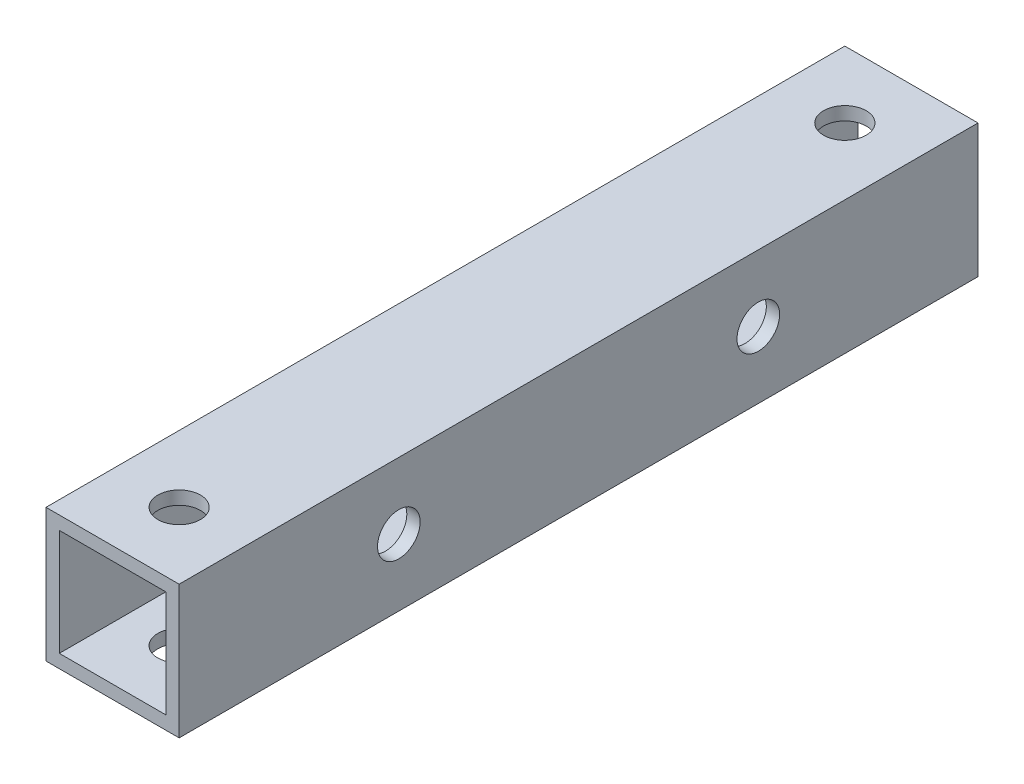
ISO-10303-21;
HEADER;
FILE_DESCRIPTION(('STEP AP214'),'2;1');
FILE_NAME('part.step','',(''),(''),'','','');
FILE_SCHEMA(('AUTOMOTIVE_DESIGN { 1 0 10303 214 1 1 1 1 }'));
ENDSEC;
DATA;
#1=APPLICATION_CONTEXT('core data for automotive mechanical design processes');
#2=APPLICATION_PROTOCOL_DEFINITION('international standard','automotive_design',2000,#1);
#3=PRODUCT_CONTEXT('',#1,'mechanical');
#4=PRODUCT('Part','Part','',(#3));
#5=PRODUCT_RELATED_PRODUCT_CATEGORY('part','',(#4));
#6=PRODUCT_DEFINITION_FORMATION('','',#4);
#7=PRODUCT_DEFINITION_CONTEXT('part definition',#1,'design');
#8=PRODUCT_DEFINITION('design','',#6,#7);
#9=PRODUCT_DEFINITION_SHAPE('','',#8);
#10=(LENGTH_UNIT() NAMED_UNIT(*) SI_UNIT(.MILLI.,.METRE.));
#11=(NAMED_UNIT(*) PLANE_ANGLE_UNIT() SI_UNIT($,.RADIAN.));
#12=(NAMED_UNIT(*) SI_UNIT($,.STERADIAN.) SOLID_ANGLE_UNIT());
#13=UNCERTAINTY_MEASURE_WITH_UNIT(LENGTH_MEASURE(1.E-05),#10,'distance_accuracy_value','');
#14=(GEOMETRIC_REPRESENTATION_CONTEXT(3) GLOBAL_UNCERTAINTY_ASSIGNED_CONTEXT((#13)) GLOBAL_UNIT_ASSIGNED_CONTEXT((#10,
#11,#12)) REPRESENTATION_CONTEXT('',''));
#15=CARTESIAN_POINT('',(0.,0.,0.));
#16=DIRECTION('',(0.,0.,1.));
#17=DIRECTION('',(1.,0.,0.));
#18=AXIS2_PLACEMENT_3D('',#15,#16,#17);
#19=CARTESIAN_POINT('',(0.,0.,30.));
#20=DIRECTION('',(0.,0.,-1.));
#21=DIRECTION('',(-1.,0.,0.));
#22=AXIS2_PLACEMENT_3D('',#19,#20,#21);
#23=PLANE('',#22);
#24=DIRECTION('',(0.,1.,0.));
#25=VECTOR('',#24,1.);
#26=CARTESIAN_POINT('',(5.,-5.,30.));
#27=LINE('',#26,#25);
#28=CARTESIAN_POINT('',(5.,-5.,30.));
#29=VERTEX_POINT('',#28);
#30=CARTESIAN_POINT('',(5.,5.,30.));
#31=VERTEX_POINT('',#30);
#32=EDGE_CURVE('E172',#29,#31,#27,.T.);
#33=ORIENTED_EDGE('',*,*,#32,.T.);
#34=DIRECTION('',(-1.,0.,0.));
#35=VECTOR('',#34,1.);
#36=CARTESIAN_POINT('',(-5.,5.,30.));
#37=LINE('',#36,#35);
#38=CARTESIAN_POINT('',(-5.,5.,30.));
#39=VERTEX_POINT('',#38);
#40=EDGE_CURVE('E174',#31,#39,#37,.T.);
#41=ORIENTED_EDGE('',*,*,#40,.T.);
#42=DIRECTION('',(0.,-1.,0.));
#43=VECTOR('',#42,1.);
#44=CARTESIAN_POINT('',(-5.,-5.,30.));
#45=LINE('',#44,#43);
#46=CARTESIAN_POINT('',(-5.,-5.,30.));
#47=VERTEX_POINT('',#46);
#48=EDGE_CURVE('E176',#39,#47,#45,.T.);
#49=ORIENTED_EDGE('',*,*,#48,.T.);
#50=DIRECTION('',(1.,0.,0.));
#51=VECTOR('',#50,1.);
#52=CARTESIAN_POINT('',(-5.,-5.,30.));
#53=LINE('',#52,#51);
#54=EDGE_CURVE('E58',#47,#29,#53,.T.);
#55=ORIENTED_EDGE('',*,*,#54,.T.);
#56=EDGE_LOOP('',(#33,#41,#49,#55));
#57=FACE_BOUND('',#56,.T.);
#58=DIRECTION('',(0.,1.,0.));
#59=VECTOR('',#58,1.);
#60=CARTESIAN_POINT('',(4.,-4.,30.));
#61=LINE('',#60,#59);
#62=CARTESIAN_POINT('',(4.,-4.,30.));
#63=VERTEX_POINT('',#62);
#64=CARTESIAN_POINT('',(4.,4.,30.));
#65=VERTEX_POINT('',#64);
#66=EDGE_CURVE('E161',#63,#65,#61,.T.);
#67=ORIENTED_EDGE('',*,*,#66,.F.);
#68=DIRECTION('',(1.,0.,0.));
#69=VECTOR('',#68,1.);
#70=CARTESIAN_POINT('',(-4.,-4.,30.));
#71=LINE('',#70,#69);
#72=CARTESIAN_POINT('',(-4.,-4.,30.));
#73=VERTEX_POINT('',#72);
#74=EDGE_CURVE('E105',#73,#63,#71,.T.);
#75=ORIENTED_EDGE('',*,*,#74,.F.);
#76=DIRECTION('',(0.,-1.,0.));
#77=VECTOR('',#76,1.);
#78=CARTESIAN_POINT('',(-4.,-4.,30.));
#79=LINE('',#78,#77);
#80=CARTESIAN_POINT('',(-4.,4.,30.));
#81=VERTEX_POINT('',#80);
#82=EDGE_CURVE('E165',#81,#73,#79,.T.);
#83=ORIENTED_EDGE('',*,*,#82,.F.);
#84=DIRECTION('',(-1.,0.,0.));
#85=VECTOR('',#84,1.);
#86=CARTESIAN_POINT('',(-4.,4.,30.));
#87=LINE('',#86,#85);
#88=EDGE_CURVE('E163',#65,#81,#87,.T.);
#89=ORIENTED_EDGE('',*,*,#88,.F.);
#90=EDGE_LOOP('',(#67,#75,#83,#89));
#91=FACE_BOUND('',#90,.T.);
#92=ADVANCED_FACE('F33',(#57,#91),#23,.F.);
#93=CARTESIAN_POINT('',(5.,-5.,30.));
#94=DIRECTION('',(-1.,0.,0.));
#95=DIRECTION('',(0.,0.,1.));
#96=AXIS2_PLACEMENT_3D('',#93,#94,#95);
#97=PLANE('',#96);
#98=CARTESIAN_POINT('',(5.,0.,-13.5));
#99=DIRECTION('',(-1.,0.,0.));
#100=DIRECTION('',(0.,0.,1.));
#101=AXIS2_PLACEMENT_3D('',#98,#99,#100);
#102=CIRCLE('',#101,1.6);
#103=CARTESIAN_POINT('',(5.,0.,-11.9));
#104=VERTEX_POINT('',#103);
#105=EDGE_CURVE('E194',#104,#104,#102,.T.);
#106=ORIENTED_EDGE('',*,*,#105,.T.);
#107=EDGE_LOOP('',(#106));
#108=FACE_BOUND('',#107,.T.);
#109=CARTESIAN_POINT('',(5.,0.,13.5));
#110=DIRECTION('',(1.,0.,0.));
#111=DIRECTION('',(0.,0.,-1.));
#112=AXIS2_PLACEMENT_3D('',#109,#110,#111);
#113=CIRCLE('',#112,1.6);
#114=CARTESIAN_POINT('',(5.,0.,11.9));
#115=VERTEX_POINT('',#114);
#116=EDGE_CURVE('E151',#115,#115,#113,.T.);
#117=ORIENTED_EDGE('',*,*,#116,.F.);
#118=EDGE_LOOP('',(#117));
#119=FACE_BOUND('',#118,.T.);
#120=DIRECTION('',(0.,0.,-1.));
#121=VECTOR('',#120,1.);
#122=CARTESIAN_POINT('',(5.,-5.,30.));
#123=LINE('',#122,#121);
#124=CARTESIAN_POINT('',(5.,-5.,-30.));
#125=VERTEX_POINT('',#124);
#126=EDGE_CURVE('E179',#29,#125,#123,.T.);
#127=ORIENTED_EDGE('',*,*,#126,.T.);
#128=DIRECTION('',(0.,1.,0.));
#129=VECTOR('',#128,1.);
#130=CARTESIAN_POINT('',(5.,-5.,-30.));
#131=LINE('',#130,#129);
#132=CARTESIAN_POINT('',(5.,5.,-30.));
#133=VERTEX_POINT('',#132);
#134=EDGE_CURVE('E129',#125,#133,#131,.T.);
#135=ORIENTED_EDGE('',*,*,#134,.T.);
#136=DIRECTION('',(0.,0.,-1.));
#137=VECTOR('',#136,1.);
#138=CARTESIAN_POINT('',(5.,5.,30.));
#139=LINE('',#138,#137);
#140=EDGE_CURVE('E11',#31,#133,#139,.T.);
#141=ORIENTED_EDGE('',*,*,#140,.F.);
#142=ORIENTED_EDGE('',*,*,#32,.F.);
#143=EDGE_LOOP('',(#127,#135,#141,#142));
#144=FACE_BOUND('',#143,.T.);
#145=ADVANCED_FACE('F35',(#108,#119,#144),#97,.F.);
#146=CARTESIAN_POINT('',(-5.,5.,30.));
#147=DIRECTION('',(0.,-1.,0.));
#148=DIRECTION('',(0.,0.,-1.));
#149=AXIS2_PLACEMENT_3D('',#146,#147,#148);
#150=PLANE('',#149);
#151=CARTESIAN_POINT('',(0.,5.,-25.));
#152=DIRECTION('',(0.,-1.,0.));
#153=DIRECTION('',(0.,0.,-1.));
#154=AXIS2_PLACEMENT_3D('',#151,#152,#153);
#155=CIRCLE('',#154,1.6);
#156=CARTESIAN_POINT('',(0.,5.,-26.6));
#157=VERTEX_POINT('',#156);
#158=EDGE_CURVE('E204',#157,#157,#155,.T.);
#159=ORIENTED_EDGE('',*,*,#158,.T.);
#160=EDGE_LOOP('',(#159));
#161=FACE_BOUND('',#160,.T.);
#162=CARTESIAN_POINT('',(0.,5.,25.));
#163=DIRECTION('',(0.,1.,0.));
#164=DIRECTION('',(0.,0.,1.));
#165=AXIS2_PLACEMENT_3D('',#162,#163,#164);
#166=CIRCLE('',#165,1.6);
#167=CARTESIAN_POINT('',(0.,5.,26.6));
#168=VERTEX_POINT('',#167);
#169=EDGE_CURVE('E141',#168,#168,#166,.T.);
#170=ORIENTED_EDGE('',*,*,#169,.F.);
#171=EDGE_LOOP('',(#170));
#172=FACE_BOUND('',#171,.T.);
#173=ORIENTED_EDGE('',*,*,#140,.T.);
#174=DIRECTION('',(-1.,0.,0.));
#175=VECTOR('',#174,1.);
#176=CARTESIAN_POINT('',(-5.,5.,-30.));
#177=LINE('',#176,#175);
#178=CARTESIAN_POINT('',(-5.,5.,-30.));
#179=VERTEX_POINT('',#178);
#180=EDGE_CURVE('E138',#133,#179,#177,.T.);
#181=ORIENTED_EDGE('',*,*,#180,.T.);
#182=DIRECTION('',(0.,0.,-1.));
#183=VECTOR('',#182,1.);
#184=CARTESIAN_POINT('',(-5.,5.,30.));
#185=LINE('',#184,#183);
#186=EDGE_CURVE('E42',#39,#179,#185,.T.);
#187=ORIENTED_EDGE('',*,*,#186,.F.);
#188=ORIENTED_EDGE('',*,*,#40,.F.);
#189=EDGE_LOOP('',(#173,#181,#187,#188));
#190=FACE_BOUND('',#189,.T.);
#191=ADVANCED_FACE('F234',(#161,#172,#190),#150,.F.);
#192=CARTESIAN_POINT('',(-5.,-5.,30.));
#193=DIRECTION('',(1.,0.,0.));
#194=DIRECTION('',(0.,0.,-1.));
#195=AXIS2_PLACEMENT_3D('',#192,#193,#194);
#196=PLANE('',#195);
#197=CARTESIAN_POINT('',(-5.,0.,-13.5));
#198=DIRECTION('',(-1.,0.,0.));
#199=DIRECTION('',(0.,0.,1.));
#200=AXIS2_PLACEMENT_3D('',#197,#198,#199);
#201=CIRCLE('',#200,1.6);
#202=CARTESIAN_POINT('',(-5.,0.,-11.9));
#203=VERTEX_POINT('',#202);
#204=EDGE_CURVE('E189',#203,#203,#201,.T.);
#205=ORIENTED_EDGE('',*,*,#204,.F.);
#206=EDGE_LOOP('',(#205));
#207=FACE_BOUND('',#206,.T.);
#208=CARTESIAN_POINT('',(-5.,0.,13.5));
#209=DIRECTION('',(1.,0.,0.));
#210=DIRECTION('',(0.,0.,-1.));
#211=AXIS2_PLACEMENT_3D('',#208,#209,#210);
#212=CIRCLE('',#211,1.6);
#213=CARTESIAN_POINT('',(-5.,0.,11.9));
#214=VERTEX_POINT('',#213);
#215=EDGE_CURVE('E152',#214,#214,#212,.T.);
#216=ORIENTED_EDGE('',*,*,#215,.T.);
#217=EDGE_LOOP('',(#216));
#218=FACE_BOUND('',#217,.T.);
#219=ORIENTED_EDGE('',*,*,#186,.T.);
#220=DIRECTION('',(0.,-1.,0.));
#221=VECTOR('',#220,1.);
#222=CARTESIAN_POINT('',(-5.,-5.,-30.));
#223=LINE('',#222,#221);
#224=CARTESIAN_POINT('',(-5.,-5.,-30.));
#225=VERTEX_POINT('',#224);
#226=EDGE_CURVE('E135',#179,#225,#223,.T.);
#227=ORIENTED_EDGE('',*,*,#226,.T.);
#228=DIRECTION('',(0.,0.,-1.));
#229=VECTOR('',#228,1.);
#230=CARTESIAN_POINT('',(-5.,-5.,30.));
#231=LINE('',#230,#229);
#232=EDGE_CURVE('E181',#47,#225,#231,.T.);
#233=ORIENTED_EDGE('',*,*,#232,.F.);
#234=ORIENTED_EDGE('',*,*,#48,.F.);
#235=EDGE_LOOP('',(#219,#227,#233,#234));
#236=FACE_BOUND('',#235,.T.);
#237=ADVANCED_FACE('F243',(#207,#218,#236),#196,.F.);
#238=CARTESIAN_POINT('',(-5.,-5.,30.));
#239=DIRECTION('',(0.,1.,0.));
#240=DIRECTION('',(0.,0.,1.));
#241=AXIS2_PLACEMENT_3D('',#238,#239,#240);
#242=PLANE('',#241);
#243=CARTESIAN_POINT('',(0.,-5.,-25.));
#244=DIRECTION('',(0.,-1.,0.));
#245=DIRECTION('',(0.,0.,-1.));
#246=AXIS2_PLACEMENT_3D('',#243,#244,#245);
#247=CIRCLE('',#246,1.6);
#248=CARTESIAN_POINT('',(0.,-5.,-26.6));
#249=VERTEX_POINT('',#248);
#250=EDGE_CURVE('E207',#249,#249,#247,.T.);
#251=ORIENTED_EDGE('',*,*,#250,.F.);
#252=EDGE_LOOP('',(#251));
#253=FACE_BOUND('',#252,.T.);
#254=CARTESIAN_POINT('',(0.,-5.,25.));
#255=DIRECTION('',(0.,1.,0.));
#256=DIRECTION('',(0.,0.,1.));
#257=AXIS2_PLACEMENT_3D('',#254,#255,#256);
#258=CIRCLE('',#257,1.6);
#259=CARTESIAN_POINT('',(0.,-5.,26.6));
#260=VERTEX_POINT('',#259);
#261=EDGE_CURVE('E142',#260,#260,#258,.T.);
#262=ORIENTED_EDGE('',*,*,#261,.T.);
#263=EDGE_LOOP('',(#262));
#264=FACE_BOUND('',#263,.T.);
#265=ORIENTED_EDGE('',*,*,#232,.T.);
#266=DIRECTION('',(1.,0.,0.));
#267=VECTOR('',#266,1.);
#268=CARTESIAN_POINT('',(-5.,-5.,-30.));
#269=LINE('',#268,#267);
#270=EDGE_CURVE('E132',#225,#125,#269,.T.);
#271=ORIENTED_EDGE('',*,*,#270,.T.);
#272=ORIENTED_EDGE('',*,*,#126,.F.);
#273=ORIENTED_EDGE('',*,*,#54,.F.);
#274=EDGE_LOOP('',(#265,#271,#272,#273));
#275=FACE_BOUND('',#274,.T.);
#276=ADVANCED_FACE('F240',(#253,#264,#275),#242,.F.);
#277=CARTESIAN_POINT('',(4.,-4.,30.));
#278=DIRECTION('',(-1.,0.,0.));
#279=DIRECTION('',(0.,0.,1.));
#280=AXIS2_PLACEMENT_3D('',#277,#278,#279);
#281=PLANE('',#280);
#282=CARTESIAN_POINT('',(4.,0.,-13.5));
#283=DIRECTION('',(-1.,0.,0.));
#284=DIRECTION('',(0.,0.,1.));
#285=AXIS2_PLACEMENT_3D('',#282,#283,#284);
#286=CIRCLE('',#285,1.6);
#287=CARTESIAN_POINT('',(4.,0.,-11.9));
#288=VERTEX_POINT('',#287);
#289=EDGE_CURVE('E117',#288,#288,#286,.F.);
#290=ORIENTED_EDGE('',*,*,#289,.T.);
#291=EDGE_LOOP('',(#290));
#292=FACE_BOUND('',#291,.T.);
#293=CARTESIAN_POINT('',(4.,0.,13.5));
#294=DIRECTION('',(-1.,0.,0.));
#295=DIRECTION('',(0.,0.,1.));
#296=AXIS2_PLACEMENT_3D('',#293,#294,#295);
#297=CIRCLE('',#296,1.6);
#298=CARTESIAN_POINT('',(4.,0.,15.1));
#299=VERTEX_POINT('',#298);
#300=EDGE_CURVE('E158',#299,#299,#297,.T.);
#301=ORIENTED_EDGE('',*,*,#300,.F.);
#302=EDGE_LOOP('',(#301));
#303=FACE_BOUND('',#302,.T.);
#304=DIRECTION('',(0.,0.,-1.));
#305=VECTOR('',#304,1.);
#306=CARTESIAN_POINT('',(4.,4.,30.));
#307=LINE('',#306,#305);
#308=CARTESIAN_POINT('',(4.,4.,-30.));
#309=VERTEX_POINT('',#308);
#310=EDGE_CURVE('E113',#65,#309,#307,.T.);
#311=ORIENTED_EDGE('',*,*,#310,.T.);
#312=DIRECTION('',(0.,1.,0.));
#313=VECTOR('',#312,1.);
#314=CARTESIAN_POINT('',(4.,-4.,-30.));
#315=LINE('',#314,#313);
#316=CARTESIAN_POINT('',(4.,-4.,-30.));
#317=VERTEX_POINT('',#316);
#318=EDGE_CURVE('E110',#317,#309,#315,.T.);
#319=ORIENTED_EDGE('',*,*,#318,.F.);
#320=DIRECTION('',(0.,0.,-1.));
#321=VECTOR('',#320,1.);
#322=CARTESIAN_POINT('',(4.,-4.,30.));
#323=LINE('',#322,#321);
#324=EDGE_CURVE('E98',#63,#317,#323,.T.);
#325=ORIENTED_EDGE('',*,*,#324,.F.);
#326=ORIENTED_EDGE('',*,*,#66,.T.);
#327=EDGE_LOOP('',(#311,#319,#325,#326));
#328=FACE_BOUND('',#327,.T.);
#329=ADVANCED_FACE('F111',(#292,#303,#328),#281,.T.);
#330=CARTESIAN_POINT('',(-4.,4.,30.));
#331=DIRECTION('',(0.,-1.,0.));
#332=DIRECTION('',(0.,0.,-1.));
#333=AXIS2_PLACEMENT_3D('',#330,#331,#332);
#334=PLANE('',#333);
#335=CARTESIAN_POINT('',(0.,4.,-25.));
#336=DIRECTION('',(0.,-1.,0.));
#337=DIRECTION('',(0.,0.,-1.));
#338=AXIS2_PLACEMENT_3D('',#335,#336,#337);
#339=CIRCLE('',#338,1.6);
#340=CARTESIAN_POINT('',(0.,4.,-26.6));
#341=VERTEX_POINT('',#340);
#342=EDGE_CURVE('E199',#341,#341,#339,.F.);
#343=ORIENTED_EDGE('',*,*,#342,.T.);
#344=EDGE_LOOP('',(#343));
#345=FACE_BOUND('',#344,.T.);
#346=CARTESIAN_POINT('',(0.,4.,25.));
#347=DIRECTION('',(0.,-1.,0.));
#348=DIRECTION('',(0.,0.,-1.));
#349=AXIS2_PLACEMENT_3D('',#346,#347,#348);
#350=CIRCLE('',#349,1.6);
#351=CARTESIAN_POINT('',(0.,4.,23.4));
#352=VERTEX_POINT('',#351);
#353=EDGE_CURVE('E148',#352,#352,#350,.T.);
#354=ORIENTED_EDGE('',*,*,#353,.F.);
#355=EDGE_LOOP('',(#354));
#356=FACE_BOUND('',#355,.T.);
#357=DIRECTION('',(0.,0.,-1.));
#358=VECTOR('',#357,1.);
#359=CARTESIAN_POINT('',(-4.,4.,30.));
#360=LINE('',#359,#358);
#361=CARTESIAN_POINT('',(-4.,4.,-30.));
#362=VERTEX_POINT('',#361);
#363=EDGE_CURVE('E169',#81,#362,#360,.T.);
#364=ORIENTED_EDGE('',*,*,#363,.T.);
#365=DIRECTION('',(-1.,0.,0.));
#366=VECTOR('',#365,1.);
#367=CARTESIAN_POINT('',(-4.,4.,-30.));
#368=LINE('',#367,#366);
#369=EDGE_CURVE('E124',#309,#362,#368,.T.);
#370=ORIENTED_EDGE('',*,*,#369,.F.);
#371=ORIENTED_EDGE('',*,*,#310,.F.);
#372=ORIENTED_EDGE('',*,*,#88,.T.);
#373=EDGE_LOOP('',(#364,#370,#371,#372));
#374=FACE_BOUND('',#373,.T.);
#375=ADVANCED_FACE('F290',(#345,#356,#374),#334,.T.);
#376=CARTESIAN_POINT('',(-4.,-4.,30.));
#377=DIRECTION('',(1.,0.,0.));
#378=DIRECTION('',(0.,0.,-1.));
#379=AXIS2_PLACEMENT_3D('',#376,#377,#378);
#380=PLANE('',#379);
#381=CARTESIAN_POINT('',(-4.,0.,-13.5));
#382=DIRECTION('',(1.,0.,0.));
#383=DIRECTION('',(0.,0.,-1.));
#384=AXIS2_PLACEMENT_3D('',#381,#382,#383);
#385=CIRCLE('',#384,1.6);
#386=CARTESIAN_POINT('',(-4.,0.,-15.1));
#387=VERTEX_POINT('',#386);
#388=EDGE_CURVE('E187',#387,#387,#385,.F.);
#389=ORIENTED_EDGE('',*,*,#388,.T.);
#390=EDGE_LOOP('',(#389));
#391=FACE_BOUND('',#390,.T.);
#392=CARTESIAN_POINT('',(-4.,0.,13.5));
#393=DIRECTION('',(1.,0.,0.));
#394=DIRECTION('',(0.,0.,-1.));
#395=AXIS2_PLACEMENT_3D('',#392,#393,#394);
#396=CIRCLE('',#395,1.6);
#397=CARTESIAN_POINT('',(-4.,0.,11.9));
#398=VERTEX_POINT('',#397);
#399=EDGE_CURVE('E155',#398,#398,#396,.T.);
#400=ORIENTED_EDGE('',*,*,#399,.F.);
#401=EDGE_LOOP('',(#400));
#402=FACE_BOUND('',#401,.T.);
#403=DIRECTION('',(0.,0.,-1.));
#404=VECTOR('',#403,1.);
#405=CARTESIAN_POINT('',(-4.,-4.,30.));
#406=LINE('',#405,#404);
#407=CARTESIAN_POINT('',(-4.,-4.,-30.));
#408=VERTEX_POINT('',#407);
#409=EDGE_CURVE('E50',#73,#408,#406,.T.);
#410=ORIENTED_EDGE('',*,*,#409,.T.);
#411=DIRECTION('',(0.,-1.,0.));
#412=VECTOR('',#411,1.);
#413=CARTESIAN_POINT('',(-4.,-4.,-30.));
#414=LINE('',#413,#412);
#415=EDGE_CURVE('E122',#362,#408,#414,.T.);
#416=ORIENTED_EDGE('',*,*,#415,.F.);
#417=ORIENTED_EDGE('',*,*,#363,.F.);
#418=ORIENTED_EDGE('',*,*,#82,.T.);
#419=EDGE_LOOP('',(#410,#416,#417,#418));
#420=FACE_BOUND('',#419,.T.);
#421=ADVANCED_FACE('F288',(#391,#402,#420),#380,.T.);
#422=CARTESIAN_POINT('',(-4.,-4.,30.));
#423=DIRECTION('',(0.,1.,0.));
#424=DIRECTION('',(0.,0.,1.));
#425=AXIS2_PLACEMENT_3D('',#422,#423,#424);
#426=PLANE('',#425);
#427=CARTESIAN_POINT('',(0.,-4.,-25.));
#428=DIRECTION('',(0.,1.,0.));
#429=DIRECTION('',(0.,0.,1.));
#430=AXIS2_PLACEMENT_3D('',#427,#428,#429);
#431=CIRCLE('',#430,1.6);
#432=CARTESIAN_POINT('',(0.,-4.,-23.4));
#433=VERTEX_POINT('',#432);
#434=EDGE_CURVE('E37',#433,#433,#431,.F.);
#435=ORIENTED_EDGE('',*,*,#434,.T.);
#436=EDGE_LOOP('',(#435));
#437=FACE_BOUND('',#436,.T.);
#438=CARTESIAN_POINT('',(0.,-4.,25.));
#439=DIRECTION('',(0.,1.,0.));
#440=DIRECTION('',(0.,0.,1.));
#441=AXIS2_PLACEMENT_3D('',#438,#439,#440);
#442=CIRCLE('',#441,1.6);
#443=CARTESIAN_POINT('',(0.,-4.,26.6));
#444=VERTEX_POINT('',#443);
#445=EDGE_CURVE('E145',#444,#444,#442,.T.);
#446=ORIENTED_EDGE('',*,*,#445,.F.);
#447=EDGE_LOOP('',(#446));
#448=FACE_BOUND('',#447,.T.);
#449=ORIENTED_EDGE('',*,*,#324,.T.);
#450=DIRECTION('',(1.,0.,0.));
#451=VECTOR('',#450,1.);
#452=CARTESIAN_POINT('',(-4.,-4.,-30.));
#453=LINE('',#452,#451);
#454=EDGE_CURVE('E102',#408,#317,#453,.T.);
#455=ORIENTED_EDGE('',*,*,#454,.F.);
#456=ORIENTED_EDGE('',*,*,#409,.F.);
#457=ORIENTED_EDGE('',*,*,#74,.T.);
#458=EDGE_LOOP('',(#449,#455,#456,#457));
#459=FACE_BOUND('',#458,.T.);
#460=ADVANCED_FACE('F100',(#437,#448,#459),#426,.T.);
#461=CARTESIAN_POINT('',(-5.,0.,13.5));
#462=DIRECTION('',(1.,0.,0.));
#463=DIRECTION('',(0.,0.,-1.));
#464=AXIS2_PLACEMENT_3D('',#461,#462,#463);
#465=CYLINDRICAL_SURFACE('',#464,1.6);
#466=ORIENTED_EDGE('',*,*,#399,.T.);
#467=EDGE_LOOP('',(#466));
#468=FACE_BOUND('',#467,.T.);
#469=ORIENTED_EDGE('',*,*,#215,.F.);
#470=EDGE_LOOP('',(#469));
#471=FACE_BOUND('',#470,.T.);
#472=ADVANCED_FACE('F282',(#468,#471),#465,.F.);
#473=ORIENTED_EDGE('',*,*,#300,.T.);
#474=EDGE_LOOP('',(#473));
#475=FACE_BOUND('',#474,.T.);
#476=ORIENTED_EDGE('',*,*,#116,.T.);
#477=EDGE_LOOP('',(#476));
#478=FACE_BOUND('',#477,.T.);
#479=ADVANCED_FACE('F280',(#475,#478),#465,.F.);
#480=CARTESIAN_POINT('',(0.,-5.,25.));
#481=DIRECTION('',(0.,1.,0.));
#482=DIRECTION('',(0.,0.,1.));
#483=AXIS2_PLACEMENT_3D('',#480,#481,#482);
#484=CYLINDRICAL_SURFACE('',#483,1.6);
#485=ORIENTED_EDGE('',*,*,#445,.T.);
#486=EDGE_LOOP('',(#485));
#487=FACE_BOUND('',#486,.T.);
#488=ORIENTED_EDGE('',*,*,#261,.F.);
#489=EDGE_LOOP('',(#488));
#490=FACE_BOUND('',#489,.T.);
#491=ADVANCED_FACE('F275',(#487,#490),#484,.F.);
#492=ORIENTED_EDGE('',*,*,#353,.T.);
#493=EDGE_LOOP('',(#492));
#494=FACE_BOUND('',#493,.T.);
#495=ORIENTED_EDGE('',*,*,#169,.T.);
#496=EDGE_LOOP('',(#495));
#497=FACE_BOUND('',#496,.T.);
#498=ADVANCED_FACE('F268',(#494,#497),#484,.F.);
#499=CARTESIAN_POINT('',(0.,0.,-30.));
#500=DIRECTION('',(0.,0.,1.));
#501=DIRECTION('',(-1.,0.,0.));
#502=AXIS2_PLACEMENT_3D('',#499,#500,#501);
#503=PLANE('',#502);
#504=ORIENTED_EDGE('',*,*,#454,.T.);
#505=ORIENTED_EDGE('',*,*,#318,.T.);
#506=ORIENTED_EDGE('',*,*,#369,.T.);
#507=ORIENTED_EDGE('',*,*,#415,.T.);
#508=EDGE_LOOP('',(#504,#505,#506,#507));
#509=FACE_BOUND('',#508,.T.);
#510=ORIENTED_EDGE('',*,*,#134,.F.);
#511=ORIENTED_EDGE('',*,*,#270,.F.);
#512=ORIENTED_EDGE('',*,*,#226,.F.);
#513=ORIENTED_EDGE('',*,*,#180,.F.);
#514=EDGE_LOOP('',(#510,#511,#512,#513));
#515=FACE_BOUND('',#514,.T.);
#516=ADVANCED_FACE('F119',(#509,#515),#503,.F.);
#517=CARTESIAN_POINT('',(-5.,0.,-13.5));
#518=DIRECTION('',(1.,0.,0.));
#519=DIRECTION('',(0.,0.,-1.));
#520=AXIS2_PLACEMENT_3D('',#517,#518,#519);
#521=CYLINDRICAL_SURFACE('',#520,1.6);
#522=ORIENTED_EDGE('',*,*,#388,.F.);
#523=EDGE_LOOP('',(#522));
#524=FACE_BOUND('',#523,.T.);
#525=ORIENTED_EDGE('',*,*,#204,.T.);
#526=EDGE_LOOP('',(#525));
#527=FACE_BOUND('',#526,.T.);
#528=ADVANCED_FACE('F226',(#524,#527),#521,.F.);
#529=ORIENTED_EDGE('',*,*,#289,.F.);
#530=EDGE_LOOP('',(#529));
#531=FACE_BOUND('',#530,.T.);
#532=ORIENTED_EDGE('',*,*,#105,.F.);
#533=EDGE_LOOP('',(#532));
#534=FACE_BOUND('',#533,.T.);
#535=ADVANCED_FACE('F219',(#531,#534),#521,.F.);
#536=CARTESIAN_POINT('',(0.,-5.,-25.));
#537=DIRECTION('',(0.,1.,0.));
#538=DIRECTION('',(0.,0.,1.));
#539=AXIS2_PLACEMENT_3D('',#536,#537,#538);
#540=CYLINDRICAL_SURFACE('',#539,1.6);
#541=ORIENTED_EDGE('',*,*,#434,.F.);
#542=EDGE_LOOP('',(#541));
#543=FACE_BOUND('',#542,.T.);
#544=ORIENTED_EDGE('',*,*,#250,.T.);
#545=EDGE_LOOP('',(#544));
#546=FACE_BOUND('',#545,.T.);
#547=ADVANCED_FACE('F216',(#543,#546),#540,.F.);
#548=ORIENTED_EDGE('',*,*,#342,.F.);
#549=EDGE_LOOP('',(#548));
#550=FACE_BOUND('',#549,.T.);
#551=ORIENTED_EDGE('',*,*,#158,.F.);
#552=EDGE_LOOP('',(#551));
#553=FACE_BOUND('',#552,.T.);
#554=ADVANCED_FACE('F218',(#550,#553),#540,.F.);
#555=CLOSED_SHELL('',(#92,#145,#191,#237,#276,#329,#375,#421,#460,#472,#479,#491,#498,#516,#528,
#535,#547,#554));
#556=MANIFOLD_SOLID_BREP('B2',#555);
#557=ADVANCED_BREP_SHAPE_REPRESENTATION('',(#18,#556),#14);
#558=SHAPE_DEFINITION_REPRESENTATION(#9,#557);
ENDSEC;
END-ISO-10303-21;
